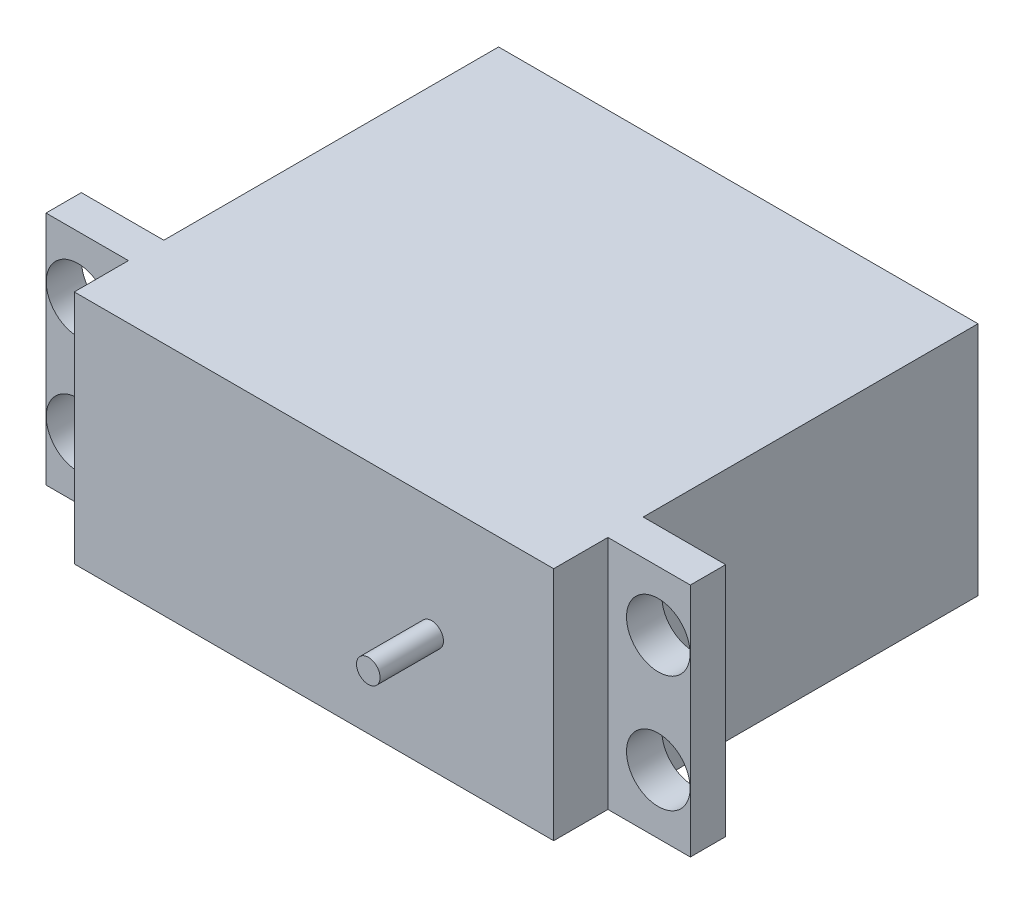
ISO-10303-21;
HEADER;
FILE_DESCRIPTION(('STEP AP214'),'2;1');
FILE_NAME('part.step','',(''),(''),'','','');
FILE_SCHEMA(('AUTOMOTIVE_DESIGN { 1 0 10303 214 1 1 1 1 }'));
ENDSEC;
DATA;
#1=APPLICATION_CONTEXT('core data for automotive mechanical design processes');
#2=APPLICATION_PROTOCOL_DEFINITION('international standard','automotive_design',2000,#1);
#3=PRODUCT_CONTEXT('',#1,'mechanical');
#4=PRODUCT('Part','Part','',(#3));
#5=PRODUCT_RELATED_PRODUCT_CATEGORY('part','',(#4));
#6=PRODUCT_DEFINITION_FORMATION('','',#4);
#7=PRODUCT_DEFINITION_CONTEXT('part definition',#1,'design');
#8=PRODUCT_DEFINITION('design','',#6,#7);
#9=PRODUCT_DEFINITION_SHAPE('','',#8);
#10=(LENGTH_UNIT() NAMED_UNIT(*) SI_UNIT(.MILLI.,.METRE.));
#11=(NAMED_UNIT(*) PLANE_ANGLE_UNIT() SI_UNIT($,.RADIAN.));
#12=(NAMED_UNIT(*) SI_UNIT($,.STERADIAN.) SOLID_ANGLE_UNIT());
#13=UNCERTAINTY_MEASURE_WITH_UNIT(LENGTH_MEASURE(1.E-05),#10,'distance_accuracy_value','');
#14=(GEOMETRIC_REPRESENTATION_CONTEXT(3) GLOBAL_UNCERTAINTY_ASSIGNED_CONTEXT((#13)) GLOBAL_UNIT_ASSIGNED_CONTEXT((#10,
#11,#12)) REPRESENTATION_CONTEXT('',''));
#15=CARTESIAN_POINT('',(0.,0.,0.));
#16=DIRECTION('',(0.,0.,1.));
#17=DIRECTION('',(1.,0.,0.));
#18=AXIS2_PLACEMENT_3D('',#15,#16,#17);
#19=CARTESIAN_POINT('',(0.,0.,36.02));
#20=DIRECTION('',(1.,0.,0.));
#21=DIRECTION('',(0.,0.,-1.));
#22=AXIS2_PLACEMENT_3D('',#19,#20,#21);
#23=PLANE('',#22);
#24=DIRECTION('',(0.,-1.,0.));
#25=VECTOR('',#24,1.);
#26=CARTESIAN_POINT('',(0.,20.,28.42));
#27=LINE('',#26,#25);
#28=CARTESIAN_POINT('',(0.,20.,28.42));
#29=VERTEX_POINT('',#28);
#30=CARTESIAN_POINT('',(0.,0.,28.42));
#31=VERTEX_POINT('',#30);
#32=EDGE_CURVE('E53',#29,#31,#27,.T.);
#33=ORIENTED_EDGE('',*,*,#32,.F.);
#34=DIRECTION('',(0.,0.,-1.));
#35=VECTOR('',#34,1.);
#36=CARTESIAN_POINT('',(0.,20.,36.02));
#37=LINE('',#36,#35);
#38=CARTESIAN_POINT('',(0.,20.,0.));
#39=VERTEX_POINT('',#38);
#40=EDGE_CURVE('E214',#29,#39,#37,.T.);
#41=ORIENTED_EDGE('',*,*,#40,.T.);
#42=DIRECTION('',(0.,-1.,0.));
#43=VECTOR('',#42,1.);
#44=CARTESIAN_POINT('',(0.,0.,0.));
#45=LINE('',#44,#43);
#46=CARTESIAN_POINT('',(0.,0.,0.));
#47=VERTEX_POINT('',#46);
#48=EDGE_CURVE('E199',#39,#47,#45,.T.);
#49=ORIENTED_EDGE('',*,*,#48,.T.);
#50=DIRECTION('',(0.,0.,-1.));
#51=VECTOR('',#50,1.);
#52=CARTESIAN_POINT('',(0.,0.,36.02));
#53=LINE('',#52,#51);
#54=EDGE_CURVE('E58',#31,#47,#53,.T.);
#55=ORIENTED_EDGE('',*,*,#54,.F.);
#56=EDGE_LOOP('',(#33,#41,#49,#55));
#57=FACE_BOUND('',#56,.T.);
#58=ADVANCED_FACE('F38',(#57),#23,.F.);
#59=DIRECTION('',(0.,1.,0.));
#60=VECTOR('',#59,1.);
#61=CARTESIAN_POINT('',(0.,20.,31.42));
#62=LINE('',#61,#60);
#63=CARTESIAN_POINT('',(0.,0.,31.42));
#64=VERTEX_POINT('',#63);
#65=CARTESIAN_POINT('',(0.,20.,31.42));
#66=VERTEX_POINT('',#65);
#67=EDGE_CURVE('E148',#64,#66,#62,.T.);
#68=ORIENTED_EDGE('',*,*,#67,.F.);
#69=CARTESIAN_POINT('',(0.,0.,36.02));
#70=VERTEX_POINT('',#69);
#71=EDGE_CURVE('E46',#70,#64,#53,.T.);
#72=ORIENTED_EDGE('',*,*,#71,.F.);
#73=DIRECTION('',(0.,-1.,0.));
#74=VECTOR('',#73,1.);
#75=CARTESIAN_POINT('',(0.,0.,36.02));
#76=LINE('',#75,#74);
#77=CARTESIAN_POINT('',(0.,20.,36.02));
#78=VERTEX_POINT('',#77);
#79=EDGE_CURVE('E200',#78,#70,#76,.T.);
#80=ORIENTED_EDGE('',*,*,#79,.F.);
#81=EDGE_CURVE('E227',#78,#66,#37,.T.);
#82=ORIENTED_EDGE('',*,*,#81,.T.);
#83=EDGE_LOOP('',(#68,#72,#80,#82));
#84=FACE_BOUND('',#83,.T.);
#85=ADVANCED_FACE('F280',(#84),#23,.F.);
#86=CARTESIAN_POINT('',(40.7,0.,36.02));
#87=DIRECTION('',(-1.,0.,0.));
#88=DIRECTION('',(0.,0.,1.));
#89=AXIS2_PLACEMENT_3D('',#86,#87,#88);
#90=PLANE('',#89);
#91=DIRECTION('',(0.,1.,0.));
#92=VECTOR('',#91,1.);
#93=CARTESIAN_POINT('',(40.7,20.,28.42));
#94=LINE('',#93,#92);
#95=CARTESIAN_POINT('',(40.7,0.,28.42));
#96=VERTEX_POINT('',#95);
#97=CARTESIAN_POINT('',(40.7,20.,28.42));
#98=VERTEX_POINT('',#97);
#99=EDGE_CURVE('E152',#96,#98,#94,.T.);
#100=ORIENTED_EDGE('',*,*,#99,.F.);
#101=DIRECTION('',(0.,0.,-1.));
#102=VECTOR('',#101,1.);
#103=CARTESIAN_POINT('',(40.7,0.,36.02));
#104=LINE('',#103,#102);
#105=CARTESIAN_POINT('',(40.7,0.,0.));
#106=VERTEX_POINT('',#105);
#107=EDGE_CURVE('E235',#96,#106,#104,.T.);
#108=ORIENTED_EDGE('',*,*,#107,.T.);
#109=DIRECTION('',(0.,1.,0.));
#110=VECTOR('',#109,1.);
#111=CARTESIAN_POINT('',(40.7,0.,0.));
#112=LINE('',#111,#110);
#113=CARTESIAN_POINT('',(40.7,20.,0.));
#114=VERTEX_POINT('',#113);
#115=EDGE_CURVE('E220',#106,#114,#112,.T.);
#116=ORIENTED_EDGE('',*,*,#115,.T.);
#117=DIRECTION('',(0.,0.,-1.));
#118=VECTOR('',#117,1.);
#119=CARTESIAN_POINT('',(40.7,20.,36.02));
#120=LINE('',#119,#118);
#121=EDGE_CURVE('E230',#98,#114,#120,.T.);
#122=ORIENTED_EDGE('',*,*,#121,.F.);
#123=EDGE_LOOP('',(#100,#108,#116,#122));
#124=FACE_BOUND('',#123,.T.);
#125=ADVANCED_FACE('F254',(#124),#90,.F.);
#126=DIRECTION('',(0.,-1.,0.));
#127=VECTOR('',#126,1.);
#128=CARTESIAN_POINT('',(40.7,20.,31.42));
#129=LINE('',#128,#127);
#130=CARTESIAN_POINT('',(40.7,20.,31.42));
#131=VERTEX_POINT('',#130);
#132=CARTESIAN_POINT('',(40.7,0.,31.42));
#133=VERTEX_POINT('',#132);
#134=EDGE_CURVE('E157',#131,#133,#129,.T.);
#135=ORIENTED_EDGE('',*,*,#134,.F.);
#136=CARTESIAN_POINT('',(40.7,20.,36.02));
#137=VERTEX_POINT('',#136);
#138=EDGE_CURVE('E231',#137,#131,#120,.T.);
#139=ORIENTED_EDGE('',*,*,#138,.F.);
#140=DIRECTION('',(0.,1.,0.));
#141=VECTOR('',#140,1.);
#142=CARTESIAN_POINT('',(40.7,0.,36.02));
#143=LINE('',#142,#141);
#144=CARTESIAN_POINT('',(40.7,0.,36.02));
#145=VERTEX_POINT('',#144);
#146=EDGE_CURVE('E208',#145,#137,#143,.T.);
#147=ORIENTED_EDGE('',*,*,#146,.F.);
#148=EDGE_CURVE('E236',#145,#133,#104,.T.);
#149=ORIENTED_EDGE('',*,*,#148,.T.);
#150=EDGE_LOOP('',(#135,#139,#147,#149));
#151=FACE_BOUND('',#150,.T.);
#152=ADVANCED_FACE('F272',(#151),#90,.F.);
#153=CARTESIAN_POINT('',(0.,0.,36.02));
#154=DIRECTION('',(0.,1.,0.));
#155=DIRECTION('',(0.,0.,1.));
#156=AXIS2_PLACEMENT_3D('',#153,#154,#155);
#157=PLANE('',#156);
#158=DIRECTION('',(1.,0.,0.));
#159=VECTOR('',#158,1.);
#160=CARTESIAN_POINT('',(0.,0.,0.));
#161=LINE('',#160,#159);
#162=EDGE_CURVE('E217',#47,#106,#161,.T.);
#163=ORIENTED_EDGE('',*,*,#162,.T.);
#164=ORIENTED_EDGE('',*,*,#107,.F.);
#165=DIRECTION('',(-1.,0.,0.));
#166=VECTOR('',#165,1.);
#167=CARTESIAN_POINT('',(47.7,0.,28.42));
#168=LINE('',#167,#166);
#169=CARTESIAN_POINT('',(47.7,0.,28.42));
#170=VERTEX_POINT('',#169);
#171=EDGE_CURVE('E175',#170,#96,#168,.T.);
#172=ORIENTED_EDGE('',*,*,#171,.F.);
#173=DIRECTION('',(0.,0.,-1.));
#174=VECTOR('',#173,1.);
#175=CARTESIAN_POINT('',(47.7,0.,28.42));
#176=LINE('',#175,#174);
#177=CARTESIAN_POINT('',(47.7,0.,31.42));
#178=VERTEX_POINT('',#177);
#179=EDGE_CURVE('E173',#178,#170,#176,.T.);
#180=ORIENTED_EDGE('',*,*,#179,.F.);
#181=DIRECTION('',(-1.,0.,0.));
#182=VECTOR('',#181,1.);
#183=CARTESIAN_POINT('',(47.7,0.,31.42));
#184=LINE('',#183,#182);
#185=EDGE_CURVE('E183',#178,#133,#184,.T.);
#186=ORIENTED_EDGE('',*,*,#185,.T.);
#187=ORIENTED_EDGE('',*,*,#148,.F.);
#188=DIRECTION('',(1.,0.,0.));
#189=VECTOR('',#188,1.);
#190=CARTESIAN_POINT('',(0.,0.,36.02));
#191=LINE('',#190,#189);
#192=EDGE_CURVE('E204',#70,#145,#191,.T.);
#193=ORIENTED_EDGE('',*,*,#192,.F.);
#194=ORIENTED_EDGE('',*,*,#71,.T.);
#195=DIRECTION('',(1.,0.,0.));
#196=VECTOR('',#195,1.);
#197=CARTESIAN_POINT('',(-7.,0.,31.42));
#198=LINE('',#197,#196);
#199=CARTESIAN_POINT('',(-7.,0.,31.42));
#200=VERTEX_POINT('',#199);
#201=EDGE_CURVE('E133',#200,#64,#198,.T.);
#202=ORIENTED_EDGE('',*,*,#201,.F.);
#203=DIRECTION('',(0.,0.,1.));
#204=VECTOR('',#203,1.);
#205=CARTESIAN_POINT('',(-7.,0.,28.42));
#206=LINE('',#205,#204);
#207=CARTESIAN_POINT('',(-7.,0.,28.42));
#208=VERTEX_POINT('',#207);
#209=EDGE_CURVE('E125',#208,#200,#206,.T.);
#210=ORIENTED_EDGE('',*,*,#209,.F.);
#211=DIRECTION('',(1.,0.,0.));
#212=VECTOR('',#211,1.);
#213=CARTESIAN_POINT('',(-7.,0.,28.42));
#214=LINE('',#213,#212);
#215=EDGE_CURVE('E130',#208,#31,#214,.T.);
#216=ORIENTED_EDGE('',*,*,#215,.T.);
#217=ORIENTED_EDGE('',*,*,#54,.T.);
#218=EDGE_LOOP('',(#163,#164,#172,#180,#186,#187,#193,#194,#202,#210,#216,#217));
#219=FACE_BOUND('',#218,.T.);
#220=ADVANCED_FACE('F128',(#219),#157,.F.);
#221=CARTESIAN_POINT('',(0.,20.,36.02));
#222=DIRECTION('',(0.,-1.,0.));
#223=DIRECTION('',(0.,0.,-1.));
#224=AXIS2_PLACEMENT_3D('',#221,#222,#223);
#225=PLANE('',#224);
#226=DIRECTION('',(-1.,0.,0.));
#227=VECTOR('',#226,1.);
#228=CARTESIAN_POINT('',(0.,20.,0.));
#229=LINE('',#228,#227);
#230=EDGE_CURVE('E205',#114,#39,#229,.T.);
#231=ORIENTED_EDGE('',*,*,#230,.T.);
#232=ORIENTED_EDGE('',*,*,#40,.F.);
#233=DIRECTION('',(1.,0.,0.));
#234=VECTOR('',#233,1.);
#235=CARTESIAN_POINT('',(-7.,20.,28.42));
#236=LINE('',#235,#234);
#237=CARTESIAN_POINT('',(-7.,20.,28.42));
#238=VERTEX_POINT('',#237);
#239=EDGE_CURVE('E291',#238,#29,#236,.T.);
#240=ORIENTED_EDGE('',*,*,#239,.F.);
#241=DIRECTION('',(0.,0.,-1.));
#242=VECTOR('',#241,1.);
#243=CARTESIAN_POINT('',(-7.,20.,28.42));
#244=LINE('',#243,#242);
#245=CARTESIAN_POINT('',(-7.,20.,31.42));
#246=VERTEX_POINT('',#245);
#247=EDGE_CURVE('E143',#246,#238,#244,.T.);
#248=ORIENTED_EDGE('',*,*,#247,.F.);
#249=DIRECTION('',(1.,0.,0.));
#250=VECTOR('',#249,1.);
#251=CARTESIAN_POINT('',(-7.,20.,31.42));
#252=LINE('',#251,#250);
#253=EDGE_CURVE('E159',#246,#66,#252,.T.);
#254=ORIENTED_EDGE('',*,*,#253,.T.);
#255=ORIENTED_EDGE('',*,*,#81,.F.);
#256=DIRECTION('',(-1.,0.,0.));
#257=VECTOR('',#256,1.);
#258=CARTESIAN_POINT('',(0.,20.,36.02));
#259=LINE('',#258,#257);
#260=EDGE_CURVE('E211',#137,#78,#259,.T.);
#261=ORIENTED_EDGE('',*,*,#260,.F.);
#262=ORIENTED_EDGE('',*,*,#138,.T.);
#263=DIRECTION('',(-1.,0.,0.));
#264=VECTOR('',#263,1.);
#265=CARTESIAN_POINT('',(47.7,20.,31.42));
#266=LINE('',#265,#264);
#267=CARTESIAN_POINT('',(47.7,20.,31.42));
#268=VERTEX_POINT('',#267);
#269=EDGE_CURVE('E187',#268,#131,#266,.T.);
#270=ORIENTED_EDGE('',*,*,#269,.F.);
#271=DIRECTION('',(0.,0.,1.));
#272=VECTOR('',#271,1.);
#273=CARTESIAN_POINT('',(47.7,20.,28.42));
#274=LINE('',#273,#272);
#275=CARTESIAN_POINT('',(47.7,20.,28.42));
#276=VERTEX_POINT('',#275);
#277=EDGE_CURVE('E167',#276,#268,#274,.T.);
#278=ORIENTED_EDGE('',*,*,#277,.F.);
#279=DIRECTION('',(-1.,0.,0.));
#280=VECTOR('',#279,1.);
#281=CARTESIAN_POINT('',(47.7,20.,28.42));
#282=LINE('',#281,#280);
#283=EDGE_CURVE('E191',#276,#98,#282,.T.);
#284=ORIENTED_EDGE('',*,*,#283,.T.);
#285=ORIENTED_EDGE('',*,*,#121,.T.);
#286=EDGE_LOOP('',(#231,#232,#240,#248,#254,#255,#261,#262,#270,#278,#284,#285));
#287=FACE_BOUND('',#286,.T.);
#288=ADVANCED_FACE('F250',(#287),#225,.F.);
#289=CARTESIAN_POINT('',(0.,0.,36.02));
#290=DIRECTION('',(0.,0.,-1.));
#291=DIRECTION('',(-1.,0.,0.));
#292=AXIS2_PLACEMENT_3D('',#289,#290,#291);
#293=PLANE('',#292);
#294=CARTESIAN_POINT('',(30.34,9.99999999999999,36.02));
#295=DIRECTION('',(0.,0.,-1.));
#296=DIRECTION('',(-1.,0.,0.));
#297=AXIS2_PLACEMENT_3D('',#294,#295,#296);
#298=CIRCLE('',#297,0.999999999999998);
#299=CARTESIAN_POINT('',(29.34,9.99999999999999,36.02));
#300=VERTEX_POINT('',#299);
#301=EDGE_CURVE('E11',#300,#300,#298,.F.);
#302=ORIENTED_EDGE('',*,*,#301,.F.);
#303=EDGE_LOOP('',(#302));
#304=FACE_BOUND('',#303,.T.);
#305=ORIENTED_EDGE('',*,*,#79,.T.);
#306=ORIENTED_EDGE('',*,*,#192,.T.);
#307=ORIENTED_EDGE('',*,*,#146,.T.);
#308=ORIENTED_EDGE('',*,*,#260,.T.);
#309=EDGE_LOOP('',(#305,#306,#307,#308));
#310=FACE_BOUND('',#309,.T.);
#311=ADVANCED_FACE('F278',(#304,#310),#293,.F.);
#312=CARTESIAN_POINT('',(0.,0.,0.));
#313=DIRECTION('',(0.,0.,-1.));
#314=DIRECTION('',(-1.,0.,0.));
#315=AXIS2_PLACEMENT_3D('',#312,#313,#314);
#316=PLANE('',#315);
#317=ORIENTED_EDGE('',*,*,#48,.F.);
#318=ORIENTED_EDGE('',*,*,#230,.F.);
#319=ORIENTED_EDGE('',*,*,#115,.F.);
#320=ORIENTED_EDGE('',*,*,#162,.F.);
#321=EDGE_LOOP('',(#317,#318,#319,#320));
#322=FACE_BOUND('',#321,.T.);
#323=ADVANCED_FACE('F246',(#322),#316,.T.);
#324=CARTESIAN_POINT('',(30.34,9.99999999999999,41.4));
#325=DIRECTION('',(0.,0.,-1.));
#326=DIRECTION('',(-1.,0.,0.));
#327=AXIS2_PLACEMENT_3D('',#324,#325,#326);
#328=CYLINDRICAL_SURFACE('',#327,0.999999999999998);
#329=CARTESIAN_POINT('',(30.34,9.99999999999999,41.4));
#330=DIRECTION('',(0.,0.,1.));
#331=DIRECTION('',(1.,0.,0.));
#332=AXIS2_PLACEMENT_3D('',#329,#330,#331);
#333=CIRCLE('',#332,0.999999999999998);
#334=CARTESIAN_POINT('',(31.34,9.99999999999999,41.4));
#335=VERTEX_POINT('',#334);
#336=EDGE_CURVE('E195',#335,#335,#333,.T.);
#337=ORIENTED_EDGE('',*,*,#336,.F.);
#338=EDGE_LOOP('',(#337));
#339=FACE_BOUND('',#338,.T.);
#340=ORIENTED_EDGE('',*,*,#301,.T.);
#341=EDGE_LOOP('',(#340));
#342=FACE_BOUND('',#341,.T.);
#343=ADVANCED_FACE('F375',(#339,#342),#328,.T.);
#344=CARTESIAN_POINT('',(30.34,9.99999999999999,41.4));
#345=DIRECTION('',(0.,0.,1.));
#346=DIRECTION('',(1.,0.,0.));
#347=AXIS2_PLACEMENT_3D('',#344,#345,#346);
#348=PLANE('',#347);
#349=ORIENTED_EDGE('',*,*,#336,.T.);
#350=EDGE_LOOP('',(#349));
#351=FACE_BOUND('',#350,.T.);
#352=ADVANCED_FACE('F380',(#351),#348,.T.);
#353=CARTESIAN_POINT('',(47.7,20.,28.42));
#354=DIRECTION('',(0.,0.,1.));
#355=DIRECTION('',(0.,-1.,0.));
#356=AXIS2_PLACEMENT_3D('',#353,#354,#355);
#357=PLANE('',#356);
#358=CARTESIAN_POINT('',(44.98,5.05,28.42));
#359=DIRECTION('',(0.,0.,1.));
#360=DIRECTION('',(1.,0.,0.));
#361=AXIS2_PLACEMENT_3D('',#358,#359,#360);
#362=CIRCLE('',#361,2.7);
#363=CARTESIAN_POINT('',(47.68,5.05,28.42));
#364=VERTEX_POINT('',#363);
#365=EDGE_CURVE('E303',#364,#364,#362,.T.);
#366=ORIENTED_EDGE('',*,*,#365,.T.);
#367=EDGE_LOOP('',(#366));
#368=FACE_BOUND('',#367,.T.);
#369=CARTESIAN_POINT('',(44.98,14.95,28.42));
#370=DIRECTION('',(0.,0.,1.));
#371=DIRECTION('',(1.,0.,0.));
#372=AXIS2_PLACEMENT_3D('',#369,#370,#371);
#373=CIRCLE('',#372,2.7);
#374=CARTESIAN_POINT('',(47.68,14.95,28.42));
#375=VERTEX_POINT('',#374);
#376=EDGE_CURVE('E287',#375,#375,#373,.T.);
#377=ORIENTED_EDGE('',*,*,#376,.T.);
#378=EDGE_LOOP('',(#377));
#379=FACE_BOUND('',#378,.T.);
#380=ORIENTED_EDGE('',*,*,#99,.T.);
#381=ORIENTED_EDGE('',*,*,#283,.F.);
#382=DIRECTION('',(0.,1.,0.));
#383=VECTOR('',#382,1.);
#384=CARTESIAN_POINT('',(47.7,20.,28.42));
#385=LINE('',#384,#383);
#386=EDGE_CURVE('E163',#170,#276,#385,.T.);
#387=ORIENTED_EDGE('',*,*,#386,.F.);
#388=ORIENTED_EDGE('',*,*,#171,.T.);
#389=EDGE_LOOP('',(#380,#381,#387,#388));
#390=FACE_BOUND('',#389,.T.);
#391=ADVANCED_FACE('F260',(#368,#379,#390),#357,.F.);
#392=CARTESIAN_POINT('',(47.7,20.,31.42));
#393=DIRECTION('',(0.,0.,-1.));
#394=DIRECTION('',(-1.,0.,0.));
#395=AXIS2_PLACEMENT_3D('',#392,#393,#394);
#396=PLANE('',#395);
#397=CARTESIAN_POINT('',(44.98,5.05,31.42));
#398=DIRECTION('',(0.,0.,1.));
#399=DIRECTION('',(1.,0.,0.));
#400=AXIS2_PLACEMENT_3D('',#397,#398,#399);
#401=CIRCLE('',#400,2.7);
#402=CARTESIAN_POINT('',(47.68,5.05,31.42));
#403=VERTEX_POINT('',#402);
#404=EDGE_CURVE('E316',#403,#403,#401,.T.);
#405=ORIENTED_EDGE('',*,*,#404,.F.);
#406=EDGE_LOOP('',(#405));
#407=FACE_BOUND('',#406,.T.);
#408=CARTESIAN_POINT('',(44.98,14.95,31.42));
#409=DIRECTION('',(0.,0.,1.));
#410=DIRECTION('',(1.,0.,0.));
#411=AXIS2_PLACEMENT_3D('',#408,#409,#410);
#412=CIRCLE('',#411,2.7);
#413=CARTESIAN_POINT('',(47.68,14.95,31.42));
#414=VERTEX_POINT('',#413);
#415=EDGE_CURVE('E299',#414,#414,#412,.T.);
#416=ORIENTED_EDGE('',*,*,#415,.F.);
#417=EDGE_LOOP('',(#416));
#418=FACE_BOUND('',#417,.T.);
#419=ORIENTED_EDGE('',*,*,#134,.T.);
#420=ORIENTED_EDGE('',*,*,#185,.F.);
#421=DIRECTION('',(0.,-1.,0.));
#422=VECTOR('',#421,1.);
#423=CARTESIAN_POINT('',(47.7,20.,31.42));
#424=LINE('',#423,#422);
#425=EDGE_CURVE('E170',#268,#178,#424,.T.);
#426=ORIENTED_EDGE('',*,*,#425,.F.);
#427=ORIENTED_EDGE('',*,*,#269,.T.);
#428=EDGE_LOOP('',(#419,#420,#426,#427));
#429=FACE_BOUND('',#428,.T.);
#430=ADVANCED_FACE('F269',(#407,#418,#429),#396,.F.);
#431=CARTESIAN_POINT('',(47.7,0.,0.));
#432=DIRECTION('',(-1.,0.,0.));
#433=DIRECTION('',(0.,0.,1.));
#434=AXIS2_PLACEMENT_3D('',#431,#432,#433);
#435=PLANE('',#434);
#436=ORIENTED_EDGE('',*,*,#386,.T.);
#437=ORIENTED_EDGE('',*,*,#277,.T.);
#438=ORIENTED_EDGE('',*,*,#425,.T.);
#439=ORIENTED_EDGE('',*,*,#179,.T.);
#440=EDGE_LOOP('',(#436,#437,#438,#439));
#441=FACE_BOUND('',#440,.T.);
#442=ADVANCED_FACE('F262',(#441),#435,.F.);
#443=CARTESIAN_POINT('',(-7.,20.,28.42));
#444=DIRECTION('',(0.,0.,1.));
#445=DIRECTION('',(1.,0.,0.));
#446=AXIS2_PLACEMENT_3D('',#443,#444,#445);
#447=PLANE('',#446);
#448=CARTESIAN_POINT('',(-4.28,14.95,28.42));
#449=DIRECTION('',(0.,0.,1.));
#450=DIRECTION('',(1.,0.,0.));
#451=AXIS2_PLACEMENT_3D('',#448,#449,#450);
#452=CIRCLE('',#451,2.7);
#453=CARTESIAN_POINT('',(-1.58,14.95,28.42));
#454=VERTEX_POINT('',#453);
#455=EDGE_CURVE('E311',#454,#454,#452,.T.);
#456=ORIENTED_EDGE('',*,*,#455,.T.);
#457=EDGE_LOOP('',(#456));
#458=FACE_BOUND('',#457,.T.);
#459=CARTESIAN_POINT('',(-4.28,5.05,28.42));
#460=DIRECTION('',(0.,0.,1.));
#461=DIRECTION('',(1.,0.,0.));
#462=AXIS2_PLACEMENT_3D('',#459,#460,#461);
#463=CIRCLE('',#462,2.7);
#464=CARTESIAN_POINT('',(-1.58,5.05,28.42));
#465=VERTEX_POINT('',#464);
#466=EDGE_CURVE('E312',#465,#465,#463,.T.);
#467=ORIENTED_EDGE('',*,*,#466,.T.);
#468=EDGE_LOOP('',(#467));
#469=FACE_BOUND('',#468,.T.);
#470=ORIENTED_EDGE('',*,*,#32,.T.);
#471=ORIENTED_EDGE('',*,*,#215,.F.);
#472=DIRECTION('',(0.,-1.,0.));
#473=VECTOR('',#472,1.);
#474=CARTESIAN_POINT('',(-7.,20.,28.42));
#475=LINE('',#474,#473);
#476=EDGE_CURVE('E138',#238,#208,#475,.T.);
#477=ORIENTED_EDGE('',*,*,#476,.F.);
#478=ORIENTED_EDGE('',*,*,#239,.T.);
#479=EDGE_LOOP('',(#470,#471,#477,#478));
#480=FACE_BOUND('',#479,.T.);
#481=ADVANCED_FACE('F150',(#458,#469,#480),#447,.F.);
#482=CARTESIAN_POINT('',(-7.,20.,31.42));
#483=DIRECTION('',(0.,0.,-1.));
#484=DIRECTION('',(-1.,0.,0.));
#485=AXIS2_PLACEMENT_3D('',#482,#483,#484);
#486=PLANE('',#485);
#487=CARTESIAN_POINT('',(-4.28,14.95,31.42));
#488=DIRECTION('',(0.,0.,1.));
#489=DIRECTION('',(1.,0.,0.));
#490=AXIS2_PLACEMENT_3D('',#487,#488,#489);
#491=CIRCLE('',#490,2.7);
#492=CARTESIAN_POINT('',(-1.58,14.95,31.42));
#493=VERTEX_POINT('',#492);
#494=EDGE_CURVE('E307',#493,#493,#491,.T.);
#495=ORIENTED_EDGE('',*,*,#494,.F.);
#496=EDGE_LOOP('',(#495));
#497=FACE_BOUND('',#496,.T.);
#498=CARTESIAN_POINT('',(-4.28,5.05,31.42));
#499=DIRECTION('',(0.,0.,1.));
#500=DIRECTION('',(1.,0.,0.));
#501=AXIS2_PLACEMENT_3D('',#498,#499,#500);
#502=CIRCLE('',#501,2.7);
#503=CARTESIAN_POINT('',(-1.58,5.05,31.42));
#504=VERTEX_POINT('',#503);
#505=EDGE_CURVE('E323',#504,#504,#502,.T.);
#506=ORIENTED_EDGE('',*,*,#505,.F.);
#507=EDGE_LOOP('',(#506));
#508=FACE_BOUND('',#507,.T.);
#509=ORIENTED_EDGE('',*,*,#67,.T.);
#510=ORIENTED_EDGE('',*,*,#253,.F.);
#511=DIRECTION('',(0.,1.,0.));
#512=VECTOR('',#511,1.);
#513=CARTESIAN_POINT('',(-7.,20.,31.42));
#514=LINE('',#513,#512);
#515=EDGE_CURVE('E137',#200,#246,#514,.T.);
#516=ORIENTED_EDGE('',*,*,#515,.F.);
#517=ORIENTED_EDGE('',*,*,#201,.T.);
#518=EDGE_LOOP('',(#509,#510,#516,#517));
#519=FACE_BOUND('',#518,.T.);
#520=ADVANCED_FACE('F294',(#497,#508,#519),#486,.F.);
#521=CARTESIAN_POINT('',(-7.,0.,0.));
#522=DIRECTION('',(-1.,0.,0.));
#523=DIRECTION('',(0.,0.,1.));
#524=AXIS2_PLACEMENT_3D('',#521,#522,#523);
#525=PLANE('',#524);
#526=ORIENTED_EDGE('',*,*,#476,.T.);
#527=ORIENTED_EDGE('',*,*,#209,.T.);
#528=ORIENTED_EDGE('',*,*,#515,.T.);
#529=ORIENTED_EDGE('',*,*,#247,.T.);
#530=EDGE_LOOP('',(#526,#527,#528,#529));
#531=FACE_BOUND('',#530,.T.);
#532=ADVANCED_FACE('F141',(#531),#525,.T.);
#533=CARTESIAN_POINT('',(-4.28,5.05,28.42));
#534=DIRECTION('',(0.,0.,1.));
#535=DIRECTION('',(1.,0.,0.));
#536=AXIS2_PLACEMENT_3D('',#533,#534,#535);
#537=CYLINDRICAL_SURFACE('',#536,2.7);
#538=ORIENTED_EDGE('',*,*,#466,.F.);
#539=EDGE_LOOP('',(#538));
#540=FACE_BOUND('',#539,.T.);
#541=ORIENTED_EDGE('',*,*,#505,.T.);
#542=EDGE_LOOP('',(#541));
#543=FACE_BOUND('',#542,.T.);
#544=ADVANCED_FACE('F332',(#540,#543),#537,.F.);
#545=CARTESIAN_POINT('',(-4.28,14.95,28.42));
#546=DIRECTION('',(0.,0.,1.));
#547=DIRECTION('',(1.,0.,0.));
#548=AXIS2_PLACEMENT_3D('',#545,#546,#547);
#549=CYLINDRICAL_SURFACE('',#548,2.7);
#550=ORIENTED_EDGE('',*,*,#455,.F.);
#551=EDGE_LOOP('',(#550));
#552=FACE_BOUND('',#551,.T.);
#553=ORIENTED_EDGE('',*,*,#494,.T.);
#554=EDGE_LOOP('',(#553));
#555=FACE_BOUND('',#554,.T.);
#556=ADVANCED_FACE('F335',(#552,#555),#549,.F.);
#557=CARTESIAN_POINT('',(44.98,14.95,28.42));
#558=DIRECTION('',(0.,0.,1.));
#559=DIRECTION('',(1.,0.,0.));
#560=AXIS2_PLACEMENT_3D('',#557,#558,#559);
#561=CYLINDRICAL_SURFACE('',#560,2.7);
#562=ORIENTED_EDGE('',*,*,#376,.F.);
#563=EDGE_LOOP('',(#562));
#564=FACE_BOUND('',#563,.T.);
#565=ORIENTED_EDGE('',*,*,#415,.T.);
#566=EDGE_LOOP('',(#565));
#567=FACE_BOUND('',#566,.T.);
#568=ADVANCED_FACE('F425',(#564,#567),#561,.F.);
#569=CARTESIAN_POINT('',(44.98,5.05,28.42));
#570=DIRECTION('',(0.,0.,1.));
#571=DIRECTION('',(1.,0.,0.));
#572=AXIS2_PLACEMENT_3D('',#569,#570,#571);
#573=CYLINDRICAL_SURFACE('',#572,2.7);
#574=ORIENTED_EDGE('',*,*,#365,.F.);
#575=EDGE_LOOP('',(#574));
#576=FACE_BOUND('',#575,.T.);
#577=ORIENTED_EDGE('',*,*,#404,.T.);
#578=EDGE_LOOP('',(#577));
#579=FACE_BOUND('',#578,.T.);
#580=ADVANCED_FACE('F435',(#576,#579),#573,.F.);
#581=CLOSED_SHELL('',(#58,#85,#125,#152,#220,#288,#311,#323,#343,#352,#391,#430,#442,#481,#520,
#532,#544,#556,#568,#580));
#582=MANIFOLD_SOLID_BREP('B2',#581);
#583=ADVANCED_BREP_SHAPE_REPRESENTATION('',(#18,#582),#14);
#584=SHAPE_DEFINITION_REPRESENTATION(#9,#583);
ENDSEC;
END-ISO-10303-21;
